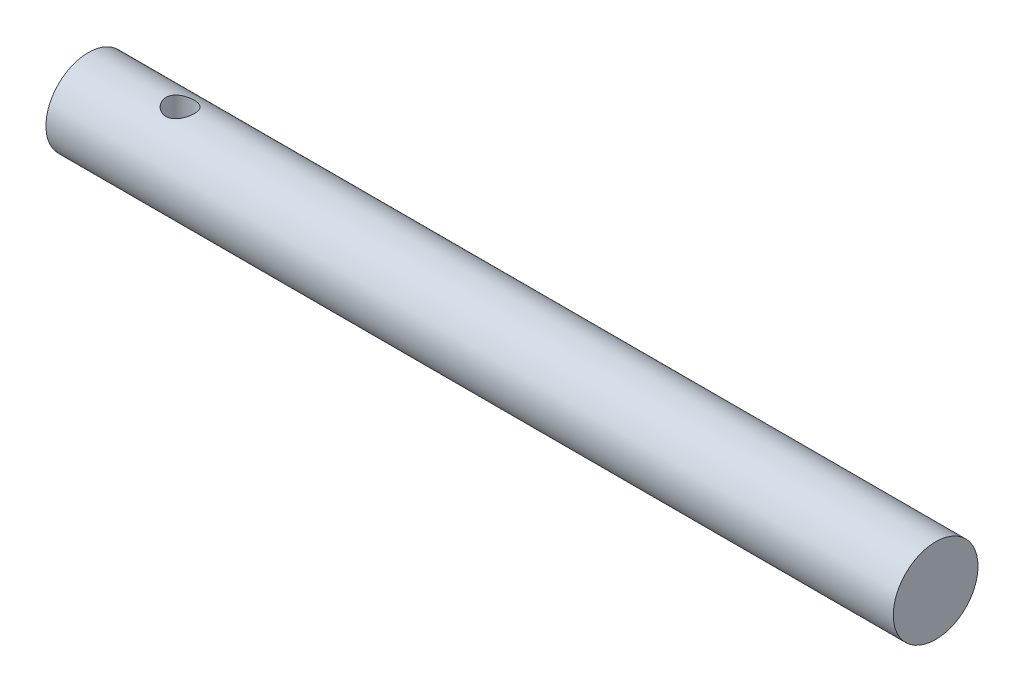
ISO-10303-21;
HEADER;
FILE_DESCRIPTION(('STEP AP214'),'2;1');
FILE_NAME('part.step','',(''),(''),'','','');
FILE_SCHEMA(('AUTOMOTIVE_DESIGN { 1 0 10303 214 1 1 1 1 }'));
ENDSEC;
DATA;
#1=APPLICATION_CONTEXT('core data for automotive mechanical design processes');
#2=APPLICATION_PROTOCOL_DEFINITION('international standard','automotive_design',2000,#1);
#3=PRODUCT_CONTEXT('',#1,'mechanical');
#4=PRODUCT('Part','Part','',(#3));
#5=PRODUCT_RELATED_PRODUCT_CATEGORY('part','',(#4));
#6=PRODUCT_DEFINITION_FORMATION('','',#4);
#7=PRODUCT_DEFINITION_CONTEXT('part definition',#1,'design');
#8=PRODUCT_DEFINITION('design','',#6,#7);
#9=PRODUCT_DEFINITION_SHAPE('','',#8);
#10=(LENGTH_UNIT() NAMED_UNIT(*) SI_UNIT(.MILLI.,.METRE.));
#11=(NAMED_UNIT(*) PLANE_ANGLE_UNIT() SI_UNIT($,.RADIAN.));
#12=(NAMED_UNIT(*) SI_UNIT($,.STERADIAN.) SOLID_ANGLE_UNIT());
#13=UNCERTAINTY_MEASURE_WITH_UNIT(LENGTH_MEASURE(1.E-05),#10,'distance_accuracy_value','');
#14=(GEOMETRIC_REPRESENTATION_CONTEXT(3) GLOBAL_UNCERTAINTY_ASSIGNED_CONTEXT((#13)) GLOBAL_UNIT_ASSIGNED_CONTEXT((#10,
#11,#12)) REPRESENTATION_CONTEXT('',''));
#15=CARTESIAN_POINT('',(0.,0.,0.));
#16=DIRECTION('',(0.,0.,1.));
#17=DIRECTION('',(1.,0.,0.));
#18=AXIS2_PLACEMENT_3D('',#15,#16,#17);
#19=CARTESIAN_POINT('',(62.5,-29.,-19.5));
#20=DIRECTION('',(-1.,0.,0.));
#21=DIRECTION('',(0.,0.,1.));
#22=AXIS2_PLACEMENT_3D('',#19,#20,#21);
#23=CYLINDRICAL_SURFACE('',#22,3.);
#24=CARTESIAN_POINT('',(62.5,-29.,-19.5));
#25=DIRECTION('',(1.,0.,0.));
#26=DIRECTION('',(0.,0.,-1.));
#27=AXIS2_PLACEMENT_3D('',#24,#25,#26);
#28=CIRCLE('',#27,3.);
#29=CARTESIAN_POINT('',(62.5,-29.,-22.5));
#30=VERTEX_POINT('',#29);
#31=EDGE_CURVE('E10',#30,#30,#28,.T.);
#32=ORIENTED_EDGE('',*,*,#31,.F.);
#33=EDGE_LOOP('',(#32));
#34=FACE_BOUND('',#33,.T.);
#35=CARTESIAN_POINT('',(2.5,-29.,-19.5));
#36=DIRECTION('',(1.,0.,0.));
#37=DIRECTION('',(0.,0.,-1.));
#38=AXIS2_PLACEMENT_3D('',#35,#36,#37);
#39=CIRCLE('',#38,3.);
#40=CARTESIAN_POINT('',(2.5,-29.,-22.5));
#41=VERTEX_POINT('',#40);
#42=EDGE_CURVE('E51',#41,#41,#39,.T.);
#43=ORIENTED_EDGE('',*,*,#42,.T.);
#44=EDGE_LOOP('',(#43));
#45=FACE_BOUND('',#44,.T.);
#46=CARTESIAN_POINT('',(9.,-31.8284271247462,-20.5));
#47=CARTESIAN_POINT('',(9.05446817481068,-31.8284269453273,-20.5000002579478));
#48=CARTESIAN_POINT('',(9.10893479977153,-31.8300176937281,-20.4955347836981));
#49=CARTESIAN_POINT('',(9.21625442095062,-31.8361757417458,-20.4778511317026));
#50=CARTESIAN_POINT('',(9.26910714986394,-31.8407435316722,-20.4646315121707));
#51=CARTESIAN_POINT('',(9.37162689301281,-31.8522820366389,-20.4299554856803));
#52=CARTESIAN_POINT('',(9.42129992944688,-31.8592480396464,-20.408515221402));
#53=CARTESIAN_POINT('',(9.5163600485438,-31.8747912201701,-20.3580616284426));
#54=CARTESIAN_POINT('',(9.5617461825525,-31.8833687530543,-20.3290466288605));
#55=CARTESIAN_POINT('',(9.64871996233949,-31.9015448940559,-20.2630511464425));
#56=CARTESIAN_POINT('',(9.69011542867204,-31.9111689484414,-20.2258243413778));
#57=CARTESIAN_POINT('',(9.76620680122432,-31.9301386480151,-20.1449876672145));
#58=CARTESIAN_POINT('',(9.80090163158228,-31.939484248291,-20.1013767750524));
#59=CARTESIAN_POINT('',(9.86347889732968,-31.9571386692166,-20.007604507965));
#60=CARTESIAN_POINT('',(9.89115997061798,-31.9654140770157,-19.9573019112245));
#61=CARTESIAN_POINT('',(9.93759158512749,-31.9796958677102,-19.8524312229875));
#62=CARTESIAN_POINT('',(9.9563445331769,-31.9857028620301,-19.7978642856872));
#63=CARTESIAN_POINT('',(9.9837358546324,-31.994590754319,-19.6880288174335));
#64=CARTESIAN_POINT('',(9.99270344625701,-31.9975731477756,-19.632850754853));
#65=CARTESIAN_POINT('',(10.0013162933607,-32.0004360821825,-19.5216978748241));
#66=CARTESIAN_POINT('',(10.0009639516524,-32.0003174226289,-19.4657232664561));
#67=CARTESIAN_POINT('',(9.99115574543397,-31.9970603961874,-19.3568964848062));
#68=CARTESIAN_POINT('',(9.9820574715255,-31.9940406475514,-19.3040079514083));
#69=CARTESIAN_POINT('',(9.95560701901955,-31.9854696733971,-19.2005565611778));
#70=CARTESIAN_POINT('',(9.93825428102025,-31.9799182763111,-19.1499938622208));
#71=CARTESIAN_POINT('',(9.89557868269387,-31.9667567029329,-19.051847525158));
#72=CARTESIAN_POINT('',(9.87015406145323,-31.9591204252427,-19.004311779031));
#73=CARTESIAN_POINT('',(9.81214029455161,-31.9425839303867,-18.9140756744728));
#74=CARTESIAN_POINT('',(9.77954915667337,-31.9336833620052,-18.8713766656152));
#75=CARTESIAN_POINT('',(9.70632560653927,-31.9150619185089,-18.7898991334481));
#76=CARTESIAN_POINT('',(9.66538684215456,-31.9053221517267,-18.7513998429324));
#77=CARTESIAN_POINT('',(9.57755127427735,-31.8864733524511,-18.6817227404041));
#78=CARTESIAN_POINT('',(9.53065355428676,-31.8773644173145,-18.650546056727));
#79=CARTESIAN_POINT('',(9.43134637438459,-31.8607052513553,-18.5960125449573));
#80=CARTESIAN_POINT('',(9.37886786863219,-31.8531790933882,-18.572773536349));
#81=CARTESIAN_POINT('',(9.27042860573374,-31.840816508783,-18.5355568067005));
#82=CARTESIAN_POINT('',(9.21446931877818,-31.8359789550122,-18.5215752042445));
#83=CARTESIAN_POINT('',(9.10336164459938,-31.8297963630207,-18.5038387179095));
#84=CARTESIAN_POINT('',(9.04829057525428,-31.8283036031514,-18.4996509044943));
#85=CARTESIAN_POINT('',(8.93822385088296,-31.828566720628,-18.5003945610884));
#86=CARTESIAN_POINT('',(8.88322818397524,-31.8303220079277,-18.5053243747727));
#87=CARTESIAN_POINT('',(8.77684303428884,-31.8367361808938,-18.5237743484482));
#88=CARTESIAN_POINT('',(8.72539456984936,-31.8412932544059,-18.5369936060194));
#89=CARTESIAN_POINT('',(8.62545639376062,-31.8526855367127,-18.5712861374394));
#90=CARTESIAN_POINT('',(8.57696720840917,-31.8595211493491,-18.5923608036365));
#91=CARTESIAN_POINT('',(8.48261957915306,-31.8749687759572,-18.6425256592611));
#92=CARTESIAN_POINT('',(8.43689335735822,-31.8836302566561,-18.6718488816415));
#93=CARTESIAN_POINT('',(8.35085394761627,-31.9016576873098,-18.7374143694424));
#94=CARTESIAN_POINT('',(8.31054236133878,-31.911023844438,-18.7736586745012));
#95=CARTESIAN_POINT('',(8.23447201590937,-31.9299503863784,-18.8541082940997));
#96=CARTESIAN_POINT('',(8.19902560998115,-31.939498435779,-18.8986127294533));
#97=CARTESIAN_POINT('',(8.13608385765196,-31.9572685161311,-18.9931727085997));
#98=CARTESIAN_POINT('',(8.10858822883758,-31.9654905941769,-19.0432280551354));
#99=CARTESIAN_POINT('',(8.06257989513829,-31.979644058106,-19.1472201375677));
#100=CARTESIAN_POINT('',(8.04400872285194,-31.9855903000453,-19.2011288766788));
#101=CARTESIAN_POINT('',(8.01627225793989,-31.9945861083777,-19.311541534154));
#102=CARTESIAN_POINT('',(8.0071035701195,-31.9976367203402,-19.3680445080461));
#103=CARTESIAN_POINT('',(7.99873792239436,-32.0004186323626,-19.47918466414));
#104=CARTESIAN_POINT('',(7.99909254606762,-32.0002992008944,-19.53378472392));
#105=CARTESIAN_POINT('',(8.00865730814641,-31.997121965194,-19.6421111450002));
#106=CARTESIAN_POINT('',(8.01786672815276,-31.9940643993357,-19.6958375768191));
#107=CARTESIAN_POINT('',(8.04458223457597,-31.9854091495442,-19.8000421194321));
#108=CARTESIAN_POINT('',(8.06195421535295,-31.9798525836118,-19.8505582709128));
#109=CARTESIAN_POINT('',(8.10437753109714,-31.9667716070446,-19.9479783509398));
#110=CARTESIAN_POINT('',(8.12943025519694,-31.959246840479,-19.9948816241424));
#111=CARTESIAN_POINT('',(8.18756951210208,-31.94265868828,-20.0856340163088));
#112=CARTESIAN_POINT('',(8.22091868538192,-31.9335487249238,-20.1293062515577));
#113=CARTESIAN_POINT('',(8.29425739115591,-31.9149298879143,-20.2105810262723));
#114=CARTESIAN_POINT('',(8.33424904226168,-31.905420887714,-20.2481816216243));
#115=CARTESIAN_POINT('',(8.42160935558804,-31.8866327982737,-20.3177418088335));
#116=CARTESIAN_POINT('',(8.46920551098077,-31.8773772799534,-20.3494229659992));
#117=CARTESIAN_POINT('',(8.56933442689865,-31.860601933163,-20.4043143432998));
#118=CARTESIAN_POINT('',(8.62186589301424,-31.8530816513617,-20.4275267768146));
#119=CARTESIAN_POINT('',(8.72796182402383,-31.8410133423053,-20.4638438282066));
#120=CARTESIAN_POINT('',(8.78137226356572,-31.836346329448,-20.4773579091633));
#121=CARTESIAN_POINT('',(8.88985605051548,-31.8300538361394,-20.4954343201617));
#122=CARTESIAN_POINT('',(8.94492881743575,-31.8284273061514,-20.4999997391965));
#123=CARTESIAN_POINT('',(9.,-31.8284271247462,-20.5));
#124=B_SPLINE_CURVE_WITH_KNOTS('',3,(#46,#47,#48,#49,#50,#51,#52,#53,#54,#55,#56,#57,#58,#59,
#60,#61,#62,#63,#64,#65,#66,#67,#68,#69,#70,#71,#72,#73,#74,#75,#76,#77,#78,#79,#80,#81,#82,#83,
#84,#85,#86,#87,#88,#89,#90,#91,#92,#93,#94,#95,#96,#97,#98,#99,#100,#101,#102,#103,#104,#105,
#106,#107,#108,#109,#110,#111,#112,#113,#114,#115,#116,#117,#118,#119,#120,#121,#122,#123),
.UNSPECIFIED.,.T.,.F.,(4,2,2,2,2,2,2,2,2,2,2,2,2,2,2,2,2,2,2,2,2,2,2,2,2,2,2,2,2,2,2,2,2,2,2,2,
2,2,4),(0.,0.163200584775418,0.326428054968879,0.489336627454542,0.652281166139157,
0.821013374229391,0.989772651673596,1.16293506139029,1.33605076382161,1.50314318760306,
1.67019253297699,1.83069004820941,1.99119844184608,2.15381654855706,2.31647991869394,
2.48680174359289,2.65714979607478,2.82992639837376,3.00263051349689,3.16754291357513,
3.33242535830307,3.49164395761849,3.65089079140019,3.81518857728788,3.979534856552,
4.15178808164165,4.32403518750605,4.49513791183925,4.6661788299723,4.82918084670709,
4.99216964002854,5.15256956033503,5.31299850756316,5.47935519513707,5.64576504425705,
5.81868902729218,5.9915677825994,6.15663212153686,6.3216394717923),.UNSPECIFIED.);
#125=CARTESIAN_POINT('',(9.,-31.8284271247462,-20.5));
#126=VERTEX_POINT('',#125);
#127=EDGE_CURVE('E60',#126,#126,#124,.T.);
#128=ORIENTED_EDGE('',*,*,#127,.F.);
#129=EDGE_LOOP('',(#128));
#130=FACE_BOUND('',#129,.T.);
#131=CARTESIAN_POINT('',(9.,-26.1715728752538,-20.5));
#132=CARTESIAN_POINT('',(8.94553182518932,-26.1715730546727,-20.5000002579478));
#133=CARTESIAN_POINT('',(8.89106520022848,-26.1699823062719,-20.4955347836981));
#134=CARTESIAN_POINT('',(8.78374557904939,-26.1638242582542,-20.4778511317026));
#135=CARTESIAN_POINT('',(8.73089285013606,-26.1592564683278,-20.4646315121707));
#136=CARTESIAN_POINT('',(8.62837310698719,-26.1477179633611,-20.4299554856803));
#137=CARTESIAN_POINT('',(8.57870007055312,-26.1407519603536,-20.408515221402));
#138=CARTESIAN_POINT('',(8.48363995145621,-26.1252087798299,-20.3580616284426));
#139=CARTESIAN_POINT('',(8.4382538174475,-26.1166312469457,-20.3290466288605));
#140=CARTESIAN_POINT('',(8.35128003766051,-26.0984551059441,-20.2630511464425));
#141=CARTESIAN_POINT('',(8.30988457132796,-26.0888310515586,-20.2258243413778));
#142=CARTESIAN_POINT('',(8.23379319877568,-26.0698613519849,-20.1449876672145));
#143=CARTESIAN_POINT('',(8.19909836841772,-26.060515751709,-20.1013767750524));
#144=CARTESIAN_POINT('',(8.13652110267032,-26.0428613307834,-20.007604507965));
#145=CARTESIAN_POINT('',(8.10884002938202,-26.0345859229843,-19.9573019112245));
#146=CARTESIAN_POINT('',(8.06240841487251,-26.0203041322898,-19.8524312229875));
#147=CARTESIAN_POINT('',(8.0436554668231,-26.0142971379699,-19.7978642856872));
#148=CARTESIAN_POINT('',(8.0162641453676,-26.005409245681,-19.6880288174335));
#149=CARTESIAN_POINT('',(8.00729655374299,-26.0024268522244,-19.632850754853));
#150=CARTESIAN_POINT('',(7.99868370663934,-25.9995639178175,-19.5216978748241));
#151=CARTESIAN_POINT('',(7.99903604834758,-25.9996825773711,-19.4657232664561));
#152=CARTESIAN_POINT('',(8.00884425456603,-26.0029396038126,-19.3568964848062));
#153=CARTESIAN_POINT('',(8.01794252847451,-26.0059593524486,-19.3040079514083));
#154=CARTESIAN_POINT('',(8.04439298098045,-26.0145303266029,-19.2005565611778));
#155=CARTESIAN_POINT('',(8.06174571897975,-26.0200817236889,-19.1499938622208));
#156=CARTESIAN_POINT('',(8.10442131730613,-26.0332432970671,-19.051847525158));
#157=CARTESIAN_POINT('',(8.12984593854678,-26.0408795747573,-19.004311779031));
#158=CARTESIAN_POINT('',(8.18785970544839,-26.0574160696133,-18.9140756744728));
#159=CARTESIAN_POINT('',(8.22045084332664,-26.0663166379948,-18.8713766656152));
#160=CARTESIAN_POINT('',(8.29367439346074,-26.0849380814911,-18.7898991334481));
#161=CARTESIAN_POINT('',(8.33461315784544,-26.0946778482733,-18.7513998429324));
#162=CARTESIAN_POINT('',(8.42244872572266,-26.1135266475489,-18.6817227404041));
#163=CARTESIAN_POINT('',(8.46934644571324,-26.1226355826855,-18.650546056727));
#164=CARTESIAN_POINT('',(8.56865362561542,-26.1392947486447,-18.5960125449573));
#165=CARTESIAN_POINT('',(8.62113213136781,-26.1468209066118,-18.572773536349));
#166=CARTESIAN_POINT('',(8.72957139426627,-26.159183491217,-18.5355568067005));
#167=CARTESIAN_POINT('',(8.78553068122183,-26.1640210449878,-18.5215752042445));
#168=CARTESIAN_POINT('',(8.89663835540062,-26.1702036369793,-18.5038387179095));
#169=CARTESIAN_POINT('',(8.95170942474573,-26.1716963968486,-18.4996509044943));
#170=CARTESIAN_POINT('',(9.06177614911704,-26.171433279372,-18.5003945610884));
#171=CARTESIAN_POINT('',(9.11677181602476,-26.1696779920723,-18.5053243747727));
#172=CARTESIAN_POINT('',(9.22315696571116,-26.1632638191062,-18.5237743484482));
#173=CARTESIAN_POINT('',(9.27460543015064,-26.1587067455941,-18.5369936060194));
#174=CARTESIAN_POINT('',(9.37454360623939,-26.1473144632873,-18.5712861374394));
#175=CARTESIAN_POINT('',(9.42303279159084,-26.1404788506509,-18.5923608036365));
#176=CARTESIAN_POINT('',(9.51738042084694,-26.1250312240428,-18.6425256592611));
#177=CARTESIAN_POINT('',(9.56310664264179,-26.1163697433439,-18.6718488816415));
#178=CARTESIAN_POINT('',(9.64914605238373,-26.0983423126902,-18.7374143694424));
#179=CARTESIAN_POINT('',(9.68945763866122,-26.088976155562,-18.7736586745012));
#180=CARTESIAN_POINT('',(9.76552798409063,-26.0700496136216,-18.8541082940997));
#181=CARTESIAN_POINT('',(9.80097439001885,-26.0605015642211,-18.8986127294533));
#182=CARTESIAN_POINT('',(9.86391614234804,-26.0427314838689,-18.9931727085997));
#183=CARTESIAN_POINT('',(9.89141177116242,-26.034509405823,-19.0432280551354));
#184=CARTESIAN_POINT('',(9.93742010486172,-26.020355941894,-19.1472201375677));
#185=CARTESIAN_POINT('',(9.95599127714807,-26.0144096999547,-19.2011288766788));
#186=CARTESIAN_POINT('',(9.98372774206011,-26.0054138916223,-19.311541534154));
#187=CARTESIAN_POINT('',(9.99289642988051,-26.0023632796598,-19.3680445080461));
#188=CARTESIAN_POINT('',(10.0012620776056,-25.9995813676374,-19.47918466414));
#189=CARTESIAN_POINT('',(10.0009074539324,-25.9997007991056,-19.53378472392));
#190=CARTESIAN_POINT('',(9.99134269185359,-26.002878034806,-19.6421111450002));
#191=CARTESIAN_POINT('',(9.98213327184724,-26.0059356006643,-19.6958375768191));
#192=CARTESIAN_POINT('',(9.95541776542403,-26.0145908504558,-19.8000421194321));
#193=CARTESIAN_POINT('',(9.93804578464705,-26.0201474163882,-19.8505582709128));
#194=CARTESIAN_POINT('',(9.89562246890287,-26.0332283929554,-19.9479783509398));
#195=CARTESIAN_POINT('',(9.87056974480306,-26.040753159521,-19.9948816241424));
#196=CARTESIAN_POINT('',(9.81243048789792,-26.05734131172,-20.0856340163088));
#197=CARTESIAN_POINT('',(9.77908131461808,-26.0664512750762,-20.1293062515577));
#198=CARTESIAN_POINT('',(9.70574260884409,-26.0850701120858,-20.2105810262723));
#199=CARTESIAN_POINT('',(9.66575095773832,-26.094579112286,-20.2481816216243));
#200=CARTESIAN_POINT('',(9.57839064441197,-26.1133672017264,-20.3177418088335));
#201=CARTESIAN_POINT('',(9.53079448901923,-26.1226227200466,-20.3494229659992));
#202=CARTESIAN_POINT('',(9.43066557310135,-26.139398066837,-20.4043143432998));
#203=CARTESIAN_POINT('',(9.37813410698576,-26.1469183486383,-20.4275267768146));
#204=CARTESIAN_POINT('',(9.27203817597617,-26.1589866576947,-20.4638438282066));
#205=CARTESIAN_POINT('',(9.21862773643428,-26.163653670552,-20.4773579091633));
#206=CARTESIAN_POINT('',(9.11014394948453,-26.1699461638606,-20.4954343201617));
#207=CARTESIAN_POINT('',(9.05507118256425,-26.1715726938486,-20.4999997391965));
#208=CARTESIAN_POINT('',(9.,-26.1715728752538,-20.5));
#209=B_SPLINE_CURVE_WITH_KNOTS('',3,(#131,#132,#133,#134,#135,#136,#137,#138,#139,#140,#141,
#142,#143,#144,#145,#146,#147,#148,#149,#150,#151,#152,#153,#154,#155,#156,#157,#158,#159,#160,
#161,#162,#163,#164,#165,#166,#167,#168,#169,#170,#171,#172,#173,#174,#175,#176,#177,#178,#179,
#180,#181,#182,#183,#184,#185,#186,#187,#188,#189,#190,#191,#192,#193,#194,#195,#196,#197,#198,
#199,#200,#201,#202,#203,#204,#205,#206,#207,#208),.UNSPECIFIED.,.T.,.F.,(4,2,2,2,2,2,2,2,2,2,2,
2,2,2,2,2,2,2,2,2,2,2,2,2,2,2,2,2,2,2,2,2,2,2,2,2,2,2,4),(0.,0.163200584775417,0.32642805496888,
0.489336627454542,0.652281166139157,0.821013374229392,0.989772651673597,1.16293506139029,
1.33605076382161,1.50314318760306,1.67019253297699,1.83069004820941,1.99119844184608,
2.15381654855706,2.31647991869394,2.48680174359289,2.65714979607478,2.82992639837377,
3.00263051349689,3.16754291357513,3.33242535830307,3.49164395761849,3.65089079140019,
3.81518857728788,3.979534856552,4.15178808164165,4.32403518750605,4.49513791183924,
4.6661788299723,4.82918084670709,4.99216964002854,5.15256956033503,5.31299850756315,
5.47935519513707,5.64576504425705,5.81868902729218,5.9915677825994,6.15663212153686,
6.3216394717923),.UNSPECIFIED.);
#210=CARTESIAN_POINT('',(9.,-26.1715728752538,-20.5));
#211=VERTEX_POINT('',#210);
#212=EDGE_CURVE('E43',#211,#211,#209,.T.);
#213=ORIENTED_EDGE('',*,*,#212,.F.);
#214=EDGE_LOOP('',(#213));
#215=FACE_BOUND('',#214,.T.);
#216=ADVANCED_FACE('F39',(#34,#45,#130,#215),#23,.T.);
#217=CARTESIAN_POINT('',(62.5,-29.,-19.5));
#218=DIRECTION('',(1.,0.,0.));
#219=DIRECTION('',(0.,0.,-1.));
#220=AXIS2_PLACEMENT_3D('',#217,#218,#219);
#221=PLANE('',#220);
#222=ORIENTED_EDGE('',*,*,#31,.T.);
#223=EDGE_LOOP('',(#222));
#224=FACE_BOUND('',#223,.T.);
#225=ADVANCED_FACE('F67',(#224),#221,.T.);
#226=CARTESIAN_POINT('',(2.5,-29.,-19.5));
#227=DIRECTION('',(1.,0.,0.));
#228=DIRECTION('',(0.,0.,-1.));
#229=AXIS2_PLACEMENT_3D('',#226,#227,#228);
#230=PLANE('',#229);
#231=ORIENTED_EDGE('',*,*,#42,.F.);
#232=EDGE_LOOP('',(#231));
#233=FACE_BOUND('',#232,.T.);
#234=ADVANCED_FACE('F66',(#233),#230,.F.);
#235=CARTESIAN_POINT('',(9.,-25.,-19.5));
#236=DIRECTION('',(0.,-1.,0.));
#237=DIRECTION('',(0.,0.,-1.));
#238=AXIS2_PLACEMENT_3D('',#235,#236,#237);
#239=CYLINDRICAL_SURFACE('',#238,1.);
#240=ORIENTED_EDGE('',*,*,#127,.T.);
#241=EDGE_LOOP('',(#240));
#242=FACE_BOUND('',#241,.T.);
#243=ORIENTED_EDGE('',*,*,#212,.T.);
#244=EDGE_LOOP('',(#243));
#245=FACE_BOUND('',#244,.T.);
#246=ADVANCED_FACE('F62',(#242,#245),#239,.F.);
#247=CLOSED_SHELL('',(#216,#225,#234,#246));
#248=MANIFOLD_SOLID_BREP('B2',#247);
#249=ADVANCED_BREP_SHAPE_REPRESENTATION('',(#18,#248),#14);
#250=SHAPE_DEFINITION_REPRESENTATION(#9,#249);
ENDSEC;
END-ISO-10303-21;
